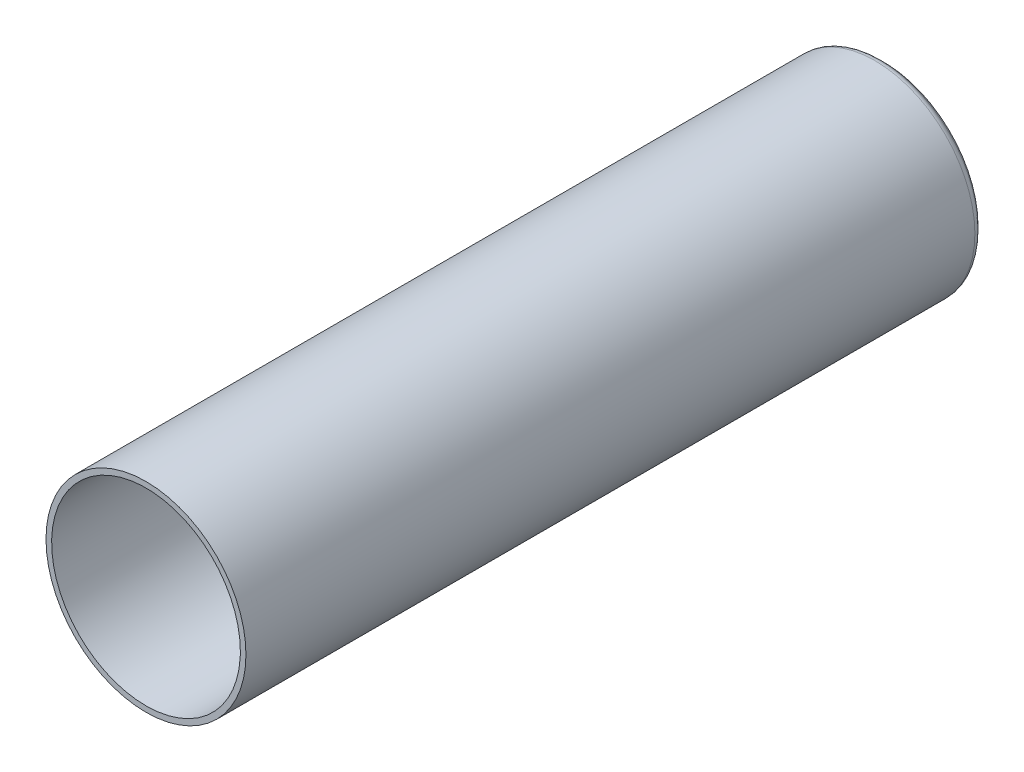
ISO-10303-21;
HEADER;
FILE_DESCRIPTION(('STEP AP214'),'2;1');
FILE_NAME('part.step','',(''),(''),'','','');
FILE_SCHEMA(('AUTOMOTIVE_DESIGN { 1 0 10303 214 1 1 1 1 }'));
ENDSEC;
DATA;
#1=APPLICATION_CONTEXT('core data for automotive mechanical design processes');
#2=APPLICATION_PROTOCOL_DEFINITION('international standard','automotive_design',2000,#1);
#3=PRODUCT_CONTEXT('',#1,'mechanical');
#4=PRODUCT('Part','Part','',(#3));
#5=PRODUCT_RELATED_PRODUCT_CATEGORY('part','',(#4));
#6=PRODUCT_DEFINITION_FORMATION('','',#4);
#7=PRODUCT_DEFINITION_CONTEXT('part definition',#1,'design');
#8=PRODUCT_DEFINITION('design','',#6,#7);
#9=PRODUCT_DEFINITION_SHAPE('','',#8);
#10=(LENGTH_UNIT() NAMED_UNIT(*) SI_UNIT(.MILLI.,.METRE.));
#11=(NAMED_UNIT(*) PLANE_ANGLE_UNIT() SI_UNIT($,.RADIAN.));
#12=(NAMED_UNIT(*) SI_UNIT($,.STERADIAN.) SOLID_ANGLE_UNIT());
#13=UNCERTAINTY_MEASURE_WITH_UNIT(LENGTH_MEASURE(1.E-05),#10,'distance_accuracy_value','');
#14=(GEOMETRIC_REPRESENTATION_CONTEXT(3) GLOBAL_UNCERTAINTY_ASSIGNED_CONTEXT((#13)) GLOBAL_UNIT_ASSIGNED_CONTEXT((#10,
#11,#12)) REPRESENTATION_CONTEXT('',''));
#15=CARTESIAN_POINT('',(0.,0.,0.));
#16=DIRECTION('',(0.,0.,1.));
#17=DIRECTION('',(1.,0.,0.));
#18=AXIS2_PLACEMENT_3D('',#15,#16,#17);
#19=CARTESIAN_POINT('',(0.,0.,97.));
#20=DIRECTION('',(0.,0.,1.));
#21=DIRECTION('',(1.,0.,0.));
#22=AXIS2_PLACEMENT_3D('',#19,#20,#21);
#23=PLANE('',#22);
#24=CARTESIAN_POINT('',(0.,0.,97.));
#25=DIRECTION('',(0.,0.,1.));
#26=DIRECTION('',(1.,0.,0.));
#27=AXIS2_PLACEMENT_3D('',#24,#25,#26);
#28=CIRCLE('',#27,13.35);
#29=CARTESIAN_POINT('',(-13.35,0.,97.));
#30=VERTEX_POINT('',#29);
#31=EDGE_CURVE('E126',#30,#30,#28,.T.);
#32=ORIENTED_EDGE('',*,*,#31,.T.);
#33=EDGE_LOOP('',(#32));
#34=FACE_BOUND('',#33,.T.);
#35=CARTESIAN_POINT('',(0.,0.,97.));
#36=DIRECTION('',(0.,0.,1.));
#37=DIRECTION('',(1.,0.,0.));
#38=AXIS2_PLACEMENT_3D('',#35,#36,#37);
#39=CIRCLE('',#38,12.6);
#40=CARTESIAN_POINT('',(12.6,0.,97.));
#41=VERTEX_POINT('',#40);
#42=EDGE_CURVE('E120',#41,#41,#39,.T.);
#43=ORIENTED_EDGE('',*,*,#42,.F.);
#44=EDGE_LOOP('',(#43));
#45=FACE_BOUND('',#44,.T.);
#46=ADVANCED_FACE('F46',(#34,#45),#23,.T.);
#47=CARTESIAN_POINT('',(0.,0.,97.));
#48=DIRECTION('',(0.,0.,-1.));
#49=DIRECTION('',(-1.,0.,0.));
#50=AXIS2_PLACEMENT_3D('',#47,#48,#49);
#51=CYLINDRICAL_SURFACE('',#50,13.35);
#52=CARTESIAN_POINT('',(0.,0.,-0.335786437626925));
#53=DIRECTION('',(0.,0.,-1.));
#54=DIRECTION('',(-1.,0.,0.));
#55=AXIS2_PLACEMENT_3D('',#52,#53,#54);
#56=CIRCLE('',#55,13.35);
#57=CARTESIAN_POINT('',(-13.35,0.,-0.335786437626925));
#58=VERTEX_POINT('',#57);
#59=EDGE_CURVE('E221',#58,#58,#56,.F.);
#60=CARTESIAN_POINT('',(-13.35,0.,-0.335786437626925));
#61=CARTESIAN_POINT('',(-13.35,0.,0.678128004431687));
#62=CARTESIAN_POINT('',(-13.35,0.,1.6920424464903));
#63=CARTESIAN_POINT('',(-13.35,0.,3.71987133060753));
#64=CARTESIAN_POINT('',(-13.35,0.,4.73378577266614));
#65=CARTESIAN_POINT('',(-13.35,0.,6.76161465678337));
#66=CARTESIAN_POINT('',(-13.35,0.,7.77552909884198));
#67=CARTESIAN_POINT('',(-13.35,0.,9.80335798295921));
#68=CARTESIAN_POINT('',(-13.35,0.,10.8172724250178));
#69=CARTESIAN_POINT('',(-13.35,0.,12.8451013091351));
#70=CARTESIAN_POINT('',(-13.35,0.,13.8590157511937));
#71=CARTESIAN_POINT('',(-13.35,0.,15.8868446353109));
#72=CARTESIAN_POINT('',(-13.35,0.,16.9007590773695));
#73=CARTESIAN_POINT('',(-13.35,0.,18.9285879614867));
#74=CARTESIAN_POINT('',(-13.35,0.,19.9425024035454));
#75=CARTESIAN_POINT('',(-13.35,0.,21.9703312876626));
#76=CARTESIAN_POINT('',(-13.35,0.,22.9842457297212));
#77=CARTESIAN_POINT('',(-13.35,0.,25.0120746138384));
#78=CARTESIAN_POINT('',(-13.35,0.,26.025989055897));
#79=CARTESIAN_POINT('',(-13.35,0.,28.0538179400143));
#80=CARTESIAN_POINT('',(-13.35,0.,29.0677323820729));
#81=CARTESIAN_POINT('',(-13.35,0.,31.0955612661901));
#82=CARTESIAN_POINT('',(-13.35,0.,32.1094757082487));
#83=CARTESIAN_POINT('',(-13.35,0.,34.137304592366));
#84=CARTESIAN_POINT('',(-13.35,0.,35.1512190344246));
#85=CARTESIAN_POINT('',(-13.35,0.,37.1790479185418));
#86=CARTESIAN_POINT('',(-13.35,0.,38.1929623606004));
#87=CARTESIAN_POINT('',(-13.35,0.,40.2207912447176));
#88=CARTESIAN_POINT('',(-13.35,0.,41.2347056867762));
#89=CARTESIAN_POINT('',(-13.35,0.,43.2625345708935));
#90=CARTESIAN_POINT('',(-13.35,0.,44.2764490129521));
#91=CARTESIAN_POINT('',(-13.35,0.,46.3042778970693));
#92=CARTESIAN_POINT('',(-13.35,0.,47.3181923391279));
#93=CARTESIAN_POINT('',(-13.35,0.,49.3460212232452));
#94=CARTESIAN_POINT('',(-13.35,0.,50.3599356653038));
#95=CARTESIAN_POINT('',(-13.35,0.,52.387764549421));
#96=CARTESIAN_POINT('',(-13.35,0.,53.4016789914796));
#97=CARTESIAN_POINT('',(-13.35,0.,55.4295078755968));
#98=CARTESIAN_POINT('',(-13.35,0.,56.4434223176555));
#99=CARTESIAN_POINT('',(-13.35,0.,58.4712512017727));
#100=CARTESIAN_POINT('',(-13.35,0.,59.4851656438313));
#101=CARTESIAN_POINT('',(-13.35,0.,61.5129945279485));
#102=CARTESIAN_POINT('',(-13.35,0.,62.5269089700071));
#103=CARTESIAN_POINT('',(-13.35,0.,64.5547378541244));
#104=CARTESIAN_POINT('',(-13.35,0.,65.568652296183));
#105=CARTESIAN_POINT('',(-13.35,0.,67.5964811803002));
#106=CARTESIAN_POINT('',(-13.35,0.,68.6103956223588));
#107=CARTESIAN_POINT('',(-13.35,0.,70.638224506476));
#108=CARTESIAN_POINT('',(-13.35,0.,71.6521389485346));
#109=CARTESIAN_POINT('',(-13.35,0.,73.6799678326519));
#110=CARTESIAN_POINT('',(-13.35,0.,74.6938822747105));
#111=CARTESIAN_POINT('',(-13.35,0.,76.7217111588277));
#112=CARTESIAN_POINT('',(-13.35,0.,77.7356256008863));
#113=CARTESIAN_POINT('',(-13.35,0.,79.7634544850036));
#114=CARTESIAN_POINT('',(-13.35,0.,80.7773689270622));
#115=CARTESIAN_POINT('',(-13.35,0.,82.8051978111794));
#116=CARTESIAN_POINT('',(-13.35,0.,83.819112253238));
#117=CARTESIAN_POINT('',(-13.35,0.,85.8469411373552));
#118=CARTESIAN_POINT('',(-13.35,0.,86.8608555794139));
#119=CARTESIAN_POINT('',(-13.35,0.,88.8886844635311));
#120=CARTESIAN_POINT('',(-13.35,0.,89.9025989055897));
#121=CARTESIAN_POINT('',(-13.35,0.,91.9304277897069));
#122=CARTESIAN_POINT('',(-13.35,0.,92.9443422317655));
#123=CARTESIAN_POINT('',(-13.35,0.,94.9721711158828));
#124=CARTESIAN_POINT('',(-13.35,0.,95.9860855579414));
#125=CARTESIAN_POINT('',(-13.35,0.,97.));
#126=B_SPLINE_CURVE_WITH_KNOTS('',3,(#60,#61,#62,#63,#64,#65,#66,#67,#68,#69,#70,#71,#72,#73,
#74,#75,#76,#77,#78,#79,#80,#81,#82,#83,#84,#85,#86,#87,#88,#89,#90,#91,#92,#93,#94,#95,#96,#97,
#98,#99,#100,#101,#102,#103,#104,#105,#106,#107,#108,#109,#110,#111,#112,#113,#114,#115,#116,
#117,#118,#119,#120,#121,#122,#123,#124,#125),.UNSPECIFIED.,.F.,.F.,(4,2,2,2,2,2,2,2,2,2,2,2,2,
2,2,2,2,2,2,2,2,2,2,2,2,2,2,2,2,2,2,2,4),(0.,3.04174332617584,6.08348665235169,9.12522997852752,
12.1669733047034,15.2087166308792,18.250459957055,21.2922032832309,24.3339466094067,
27.3756899355826,30.4174332617584,33.4591765879343,36.5009199141101,39.5426632402859,
42.5844065664618,45.6261498926376,48.6678932188135,51.7096365449893,54.7513798711651,
57.793123197341,60.8348665235168,63.8766098496927,66.9183531758685,69.9600965020444,
73.0018398282202,76.043583154396,79.0853264805719,82.1270698067477,85.1688131329236,
88.2105564590994,91.2522997852752,94.2940431114511,97.3357864376269),.UNSPECIFIED.);
#127=EDGE_CURVE('BSEAM167',#58,#30,#126,.T.);
#128=ORIENTED_EDGE('',*,*,#59,.T.);
#129=ORIENTED_EDGE('',*,*,#31,.F.);
#130=ORIENTED_EDGE('',*,*,#127,.T.);
#131=ORIENTED_EDGE('',*,*,#127,.F.);
#132=EDGE_LOOP('',(#128,#130,#129,#131));
#133=FACE_BOUND('',#132,.T.);
#134=ADVANCED_FACE('F167',(#133),#51,.T.);
#135=CARTESIAN_POINT('',(0.,0.,97.));
#136=DIRECTION('',(0.,0.,-1.));
#137=DIRECTION('',(-1.,0.,0.));
#138=AXIS2_PLACEMENT_3D('',#135,#136,#137);
#139=CYLINDRICAL_SURFACE('',#138,12.6);
#140=DIRECTION('',(0.,0.,-1.));
#141=VECTOR('',#140,1.);
#142=CARTESIAN_POINT('',(12.5776587646509,0.75,97.));
#143=LINE('',#142,#141);
#144=CARTESIAN_POINT('',(12.5776587646509,0.75,8.54961277568034));
#145=VERTEX_POINT('',#144);
#146=CARTESIAN_POINT('',(12.5776587646509,0.75,0.));
#147=VERTEX_POINT('',#146);
#148=EDGE_CURVE('E112',#145,#147,#143,.T.);
#149=ORIENTED_EDGE('',*,*,#148,.F.);
#150=CARTESIAN_POINT('',(12.5776587646509,0.75,8.54961277568031));
#151=CARTESIAN_POINT('',(12.5776587958293,0.74999846262089,8.71626885359949));
#152=CARTESIAN_POINT('',(12.5776839016945,0.749578647417388,8.8829245764544));
#153=CARTESIAN_POINT('',(12.5777839187885,0.747898809080807,9.21625909120077));
#154=CARTESIAN_POINT('',(12.5778588381816,0.746638648219097,9.38293788239521));
#155=CARTESIAN_POINT('',(12.5781578596453,0.741591163751137,9.88308234283975));
#156=CARTESIAN_POINT('',(12.5784562244901,0.736536833996591,10.2165363071549));
#157=CARTESIAN_POINT('',(12.579252163952,0.72281529775297,10.8833800816436));
#158=CARTESIAN_POINT('',(12.5797497448372,0.714147977585219,11.2167698894683));
#159=CARTESIAN_POINT('',(12.5809508889492,0.692672414551467,11.8833770291066));
#160=CARTESIAN_POINT('',(12.5816544246518,0.679864724987406,12.2165943780109));
#161=CARTESIAN_POINT('',(12.5828780305514,0.656687126151226,12.7162275295513));
#162=CARTESIAN_POINT('',(12.5833139377602,0.648300484714436,12.8827359872881));
#163=CARTESIAN_POINT('',(12.5842463504584,0.62994407034691,13.2156647861657));
#164=CARTESIAN_POINT('',(12.5847428551534,0.619974318167248,13.3820851284328));
#165=CARTESIAN_POINT('',(12.5857059030217,0.600072226494588,13.6841933772001));
#166=CARTESIAN_POINT('',(12.586161155723,0.590470389909984,13.8199029772125));
#167=CARTESIAN_POINT('',(12.5871229161089,0.569602469362661,14.0911945269026));
#168=CARTESIAN_POINT('',(12.5876294230938,0.558336408117535,14.2267764782973));
#169=CARTESIAN_POINT('',(12.5885202818252,0.537795061097529,14.4513069780916));
#170=CARTESIAN_POINT('',(12.588887010228,0.529160662343217,14.5403135832583));
#171=CARTESIAN_POINT('',(12.5896528280691,0.510614129104042,14.7181913711355));
#172=CARTESIAN_POINT('',(12.5900519169201,0.500702017807128,14.8070625562741));
#173=CARTESIAN_POINT('',(12.5910215482825,0.475799113965,15.0123640573098));
#174=CARTESIAN_POINT('',(12.5916066847787,0.46018938165714,15.1287235543876));
#175=CARTESIAN_POINT('',(12.5926701197426,0.429889325023043,15.3207106424713));
#176=CARTESIAN_POINT('',(12.5931158608058,0.416732141342184,15.3965715843711));
#177=CARTESIAN_POINT('',(12.5939259350518,0.391321971679258,15.5214790463265));
#178=CARTESIAN_POINT('',(12.5942654671117,0.380317015828065,15.5707660864049));
#179=CARTESIAN_POINT('',(12.5948851774383,0.359080482936559,15.65164883264));
#180=CARTESIAN_POINT('',(12.5951456978106,0.349881116370465,15.6835075320191));
#181=CARTESIAN_POINT('',(12.5956244930668,0.332107562477385,15.7355726409061));
#182=CARTESIAN_POINT('',(12.5958268845493,0.324389714687729,15.7560482513722));
#183=CARTESIAN_POINT('',(12.5961614254018,0.311022837639958,15.7854726887928));
#184=CARTESIAN_POINT('',(12.5962753525415,0.306385840912978,15.7948773424706));
#185=CARTESIAN_POINT('',(12.5965200163779,0.296160000393068,15.8131581666696));
#186=CARTESIAN_POINT('',(12.5966506874401,0.290574846889792,15.8220362125458));
#187=CARTESIAN_POINT('',(12.5968505097858,0.281714041159456,15.8333464408042));
#188=CARTESIAN_POINT('',(12.5969071676113,0.279172059415722,15.8363438698947));
#189=CARTESIAN_POINT('',(12.5970258939271,0.273762738667799,15.8420420312897));
#190=CARTESIAN_POINT('',(12.5970879634886,0.270895335217363,15.8447427046158));
#191=CARTESIAN_POINT('',(12.5972005208725,0.265601160440524,15.8489755370526));
#192=CARTESIAN_POINT('',(12.5972495122913,0.263269426324223,15.8506249759758));
#193=CARTESIAN_POINT('',(12.5973507838717,0.258377884877524,15.8535315773579));
#194=CARTESIAN_POINT('',(12.597403045483,0.255819334826131,15.8547907473103));
#195=CARTESIAN_POINT('',(12.5974773369364,0.252122673281987,15.8561618944995));
#196=CARTESIAN_POINT('',(12.5974983979537,0.251068286867012,15.8565055430289));
#197=CARTESIAN_POINT('',(12.597519597127,0.249999999999973,15.8568023840333));
#198=B_SPLINE_CURVE_WITH_KNOTS('',3,(#150,#151,#152,#153,#154,#155,#156,#157,#158,#159,#160,
#161,#162,#163,#164,#165,#166,#167,#168,#169,#170,#171,#172,#173,#174,#175,#176,#177,#178,#179,
#180,#181,#182,#183,#184,#185,#186,#187,#188,#189,#190,#191,#192,#193,#194,#195,#196,#197),
.UNSPECIFIED.,.F.,.F.,(4,2,2,2,2,2,2,2,2,2,2,2,2,2,2,2,2,2,2,2,2,2,2,4),(0.,0.49996699431315,
1.00001595096966,2.00047322349686,3.00096197666259,4.00131708385734,4.50147191138012,
5.00162018352287,5.40976170916635,5.81789766396599,6.08616525070789,6.35442796961015,
6.70656322585354,6.93748424340277,7.08890877950643,7.18833312145062,7.25385703474364,
7.28529848345986,7.31662025360448,7.32839673819558,7.34017555907506,7.34872180902802,
7.35722333919696,7.36054816669538),.UNSPECIFIED.);
#199=CARTESIAN_POINT('',(12.5975195971271,0.249999999999993,15.8568023840333));
#200=VERTEX_POINT('',#199);
#201=EDGE_CURVE('E149',#145,#200,#198,.T.);
#202=ORIENTED_EDGE('',*,*,#201,.T.);
#203=CARTESIAN_POINT('',(0.,0.,-160.783054688061));
#204=DIRECTION('',(-0.997466564503137,0.,0.0711368589291754));
#205=DIRECTION('',(-0.0711368589291754,0.,-0.997466564503137));
#206=AXIS2_PLACEMENT_3D('',#203,#204,#205);
#207=ELLIPSE('',#206,177.123367402892,12.6);
#208=CARTESIAN_POINT('',(12.5975195971271,-0.249999999999996,15.8568023840333));
#209=VERTEX_POINT('',#208);
#210=EDGE_CURVE('E121',#209,#200,#207,.T.);
#211=ORIENTED_EDGE('',*,*,#210,.F.);
#212=CARTESIAN_POINT('',(12.5975195971271,-0.25,15.8568023840333));
#213=CARTESIAN_POINT('',(12.5974623047581,-0.252886751006367,15.8559974818459));
#214=CARTESIAN_POINT('',(12.5974065146621,-0.255648330979727,15.8548661562991));
#215=CARTESIAN_POINT('',(12.5972993147629,-0.260876761445982,15.8521447338545));
#216=CARTESIAN_POINT('',(12.5972478436345,-0.263348068209666,15.8505633792118));
#217=CARTESIAN_POINT('',(12.597116896998,-0.26955689803349,15.8459888287967));
#218=CARTESIAN_POINT('',(12.5970404802817,-0.273097610335365,15.8427381506363));
#219=CARTESIAN_POINT('',(12.5968948787091,-0.279732494257571,15.8357578835234));
#220=CARTESIAN_POINT('',(12.5968257889182,-0.282820957136403,15.8320231366595));
#221=CARTESIAN_POINT('',(12.5965411897505,-0.295374005918529,15.8154393058387));
#222=CARTESIAN_POINT('',(12.5963542138653,-0.303174225172223,15.801375283792));
#223=CARTESIAN_POINT('',(12.5960091974761,-0.317168999195673,15.7725455452846));
#224=CARTESIAN_POINT('',(12.5958512565248,-0.323358058847809,15.7577776255059));
#225=CARTESIAN_POINT('',(12.5953494100055,-0.342584090364532,15.7076137202974));
#226=CARTESIAN_POINT('',(12.5950438279847,-0.353523510507369,15.6714067830386));
#227=CARTESIAN_POINT('',(12.5944727822485,-0.373286565530063,15.5984109681307));
#228=CARTESIAN_POINT('',(12.5942074300807,-0.382104355943692,15.5616207739564));
#229=CARTESIAN_POINT('',(12.5937029150032,-0.398390648221106,15.4876968394028));
#230=CARTESIAN_POINT('',(12.5934637746816,-0.405857989880949,15.4505628321622));
#231=CARTESIAN_POINT('',(12.5930040618688,-0.419876787132959,15.3761816586973));
#232=CARTESIAN_POINT('',(12.5927834650603,-0.426429449899148,15.3389347091944));
#233=CARTESIAN_POINT('',(12.5921455803583,-0.444999884956575,15.2276044784451));
#234=CARTESIAN_POINT('',(12.59174847213,-0.456046617233203,15.1533587196567));
#235=CARTESIAN_POINT('',(12.590990525202,-0.476507183493287,15.0046402308038));
#236=CARTESIAN_POINT('',(12.5906296920104,-0.485920769650633,14.9301674680339));
#237=CARTESIAN_POINT('',(12.5895878440804,-0.51244269501176,14.7064138055281));
#238=CARTESIAN_POINT('',(12.5889481844055,-0.527812698436482,14.5569274474946));
#239=CARTESIAN_POINT('',(12.5877466568212,-0.555717133773181,14.2579527646896));
#240=CARTESIAN_POINT('',(12.5871846620919,-0.568256210075438,14.1084648514821));
#241=CARTESIAN_POINT('',(12.5861234010537,-0.591295926664365,13.8093965751212));
#242=CARTESIAN_POINT('',(12.5856241081817,-0.601797431184252,13.6598162782779));
#243=CARTESIAN_POINT('',(12.5844999975285,-0.624932556887581,13.3036810894044));
#244=CARTESIAN_POINT('',(12.5838996026766,-0.636859400743842,13.0970807184458));
#245=CARTESIAN_POINT('',(12.5827895904366,-0.658422443923393,12.6837585543861));
#246=CARTESIAN_POINT('',(12.5822799750698,-0.668058592238381,12.477036758684));
#247=CARTESIAN_POINT('',(12.5808764249833,-0.694161825620634,11.8566333012263));
#248=CARTESIAN_POINT('',(12.5801081489056,-0.707816593382423,11.4428315152279));
#249=CARTESIAN_POINT('',(12.5791887419052,-0.72390223804508,10.8223453398937));
#250=CARTESIAN_POINT('',(12.5789212241726,-0.728529489821273,10.6157119848103));
#251=CARTESIAN_POINT('',(12.5784627070811,-0.736405231329604,10.2024173840893));
#252=CARTESIAN_POINT('',(12.578271707974,-0.739653716524277,9.995756138362));
#253=CARTESIAN_POINT('',(12.5779658073444,-0.744837466650514,9.58251783541201));
#254=CARTESIAN_POINT('',(12.577850868918,-0.746773368446736,9.37594078603345));
#255=CARTESIAN_POINT('',(12.5776973986788,-0.749352082651612,8.96278009819081));
#256=CARTESIAN_POINT('',(12.5776588663007,-0.749994904626856,8.75619645978678));
#257=CARTESIAN_POINT('',(12.577658764651,-0.750000000000013,8.54961277568032));
#258=B_SPLINE_CURVE_WITH_KNOTS('',3,(#212,#213,#214,#215,#216,#217,#218,#219,#220,#221,#222,
#223,#224,#225,#226,#227,#228,#229,#230,#231,#232,#233,#234,#235,#236,#237,#238,#239,#240,#241,
#242,#243,#244,#245,#246,#247,#248,#249,#250,#251,#252,#253,#254,#255,#256,#257),.UNSPECIFIED.,
.F.,.F.,(4,2,2,2,2,2,2,2,2,2,2,2,2,2,2,2,2,2,2,2,2,2,4),(0.,0.00892458622921327,
0.0176864259079112,0.0320323998488301,0.0465462088782962,0.094425982527855,0.142466979405753,
0.255667392919063,0.36917615888183,0.482781984507435,0.596236428529164,0.821391895870496,
1.04658150019967,1.49735463144107,1.94738276618382,2.39721960284345,3.01803783729245,
3.63886989458153,4.88088843369203,5.50094198542542,6.12099757771427,6.74075210370573,
7.36050204455123),.UNSPECIFIED.);
#259=CARTESIAN_POINT('',(12.5776587646509,-0.75,8.54961277568035));
#260=VERTEX_POINT('',#259);
#261=EDGE_CURVE('E70',#209,#260,#258,.T.);
#262=ORIENTED_EDGE('',*,*,#261,.T.);
#263=DIRECTION('',(0.,0.,-1.));
#264=VECTOR('',#263,1.);
#265=CARTESIAN_POINT('',(12.5776587646509,-0.75,97.));
#266=LINE('',#265,#264);
#267=CARTESIAN_POINT('',(12.5776587646509,-0.75,0.));
#268=VERTEX_POINT('',#267);
#269=EDGE_CURVE('E98',#260,#268,#266,.T.);
#270=ORIENTED_EDGE('',*,*,#269,.T.);
#271=CARTESIAN_POINT('',(0.,0.,0.));
#272=DIRECTION('',(0.,0.,1.));
#273=DIRECTION('',(1.,0.,0.));
#274=AXIS2_PLACEMENT_3D('',#271,#272,#273);
#275=CIRCLE('',#274,12.6);
#276=EDGE_CURVE('E110',#147,#268,#275,.T.);
#277=ORIENTED_EDGE('',*,*,#276,.F.);
#278=EDGE_LOOP('',(#149,#202,#211,#262,#270,#277));
#279=FACE_BOUND('',#278,.T.);
#280=ORIENTED_EDGE('',*,*,#42,.T.);
#281=EDGE_LOOP('',(#280));
#282=FACE_BOUND('',#281,.T.);
#283=ADVANCED_FACE('F108',(#279,#282),#139,.F.);
#284=CARTESIAN_POINT('',(0.,0.,0.));
#285=DIRECTION('',(0.,0.,-1.));
#286=DIRECTION('',(-1.,0.,0.));
#287=AXIS2_PLACEMENT_3D('',#284,#285,#286);
#288=PLANE('',#287);
#289=CARTESIAN_POINT('',(0.,0.,0.));
#290=DIRECTION('',(0.,0.,1.));
#291=DIRECTION('',(1.,0.,0.));
#292=AXIS2_PLACEMENT_3D('',#289,#290,#291);
#293=CIRCLE('',#292,4.5);
#294=CARTESIAN_POINT('',(4.5,0.,0.));
#295=VERTEX_POINT('',#294);
#296=EDGE_CURVE('E104',#295,#295,#293,.T.);
#297=ORIENTED_EDGE('',*,*,#296,.F.);
#298=EDGE_LOOP('',(#297));
#299=FACE_BOUND('',#298,.T.);
#300=DIRECTION('',(0.,-1.,0.));
#301=VECTOR('',#300,1.);
#302=CARTESIAN_POINT('',(11.4666515014905,0.75,0.));
#303=LINE('',#302,#301);
#304=CARTESIAN_POINT('',(11.4666515014905,0.25,0.));
#305=VERTEX_POINT('',#304);
#306=CARTESIAN_POINT('',(11.4666515014905,-0.25,0.));
#307=VERTEX_POINT('',#306);
#308=EDGE_CURVE('E113',#305,#307,#303,.T.);
#309=ORIENTED_EDGE('',*,*,#308,.F.);
#310=CARTESIAN_POINT('',(11.9679214365375,0.25,0.));
#311=DIRECTION('',(0.,0.,-1.));
#312=DIRECTION('',(-1.,0.,0.));
#313=AXIS2_PLACEMENT_3D('',#310,#311,#312);
#314=ELLIPSE('',#313,0.501269935046958,0.5);
#315=CARTESIAN_POINT('',(11.9679214365375,0.75,0.));
#316=VERTEX_POINT('',#315);
#317=EDGE_CURVE('E146',#305,#316,#314,.T.);
#318=ORIENTED_EDGE('',*,*,#317,.T.);
#319=DIRECTION('',(1.,0.,0.));
#320=VECTOR('',#319,1.);
#321=CARTESIAN_POINT('',(0.,0.75,0.));
#322=LINE('',#321,#320);
#323=EDGE_CURVE('E103',#316,#147,#322,.T.);
#324=ORIENTED_EDGE('',*,*,#323,.T.);
#325=ORIENTED_EDGE('',*,*,#276,.T.);
#326=DIRECTION('',(1.,0.,0.));
#327=VECTOR('',#326,1.);
#328=CARTESIAN_POINT('',(0.,-0.75,0.));
#329=LINE('',#328,#327);
#330=CARTESIAN_POINT('',(11.9679214365375,-0.75,0.));
#331=VERTEX_POINT('',#330);
#332=EDGE_CURVE('E96',#331,#268,#329,.T.);
#333=ORIENTED_EDGE('',*,*,#332,.F.);
#334=CARTESIAN_POINT('',(11.9679214365375,-0.25,0.));
#335=DIRECTION('',(0.,0.,-1.));
#336=DIRECTION('',(1.,0.,0.));
#337=AXIS2_PLACEMENT_3D('',#334,#335,#336);
#338=ELLIPSE('',#337,0.501269935046958,0.5);
#339=EDGE_CURVE('E62',#331,#307,#338,.T.);
#340=ORIENTED_EDGE('',*,*,#339,.T.);
#341=EDGE_LOOP('',(#309,#318,#324,#325,#333,#340));
#342=FACE_BOUND('',#341,.T.);
#343=ADVANCED_FACE('F116',(#299,#342),#288,.F.);
#344=CARTESIAN_POINT('',(0.,0.,-1.5));
#345=DIRECTION('',(0.,0.,-1.));
#346=DIRECTION('',(-1.,0.,0.));
#347=AXIS2_PLACEMENT_3D('',#344,#345,#346);
#348=PLANE('',#347);
#349=CARTESIAN_POINT('',(0.,0.,-1.5));
#350=DIRECTION('',(0.,0.,-1.));
#351=DIRECTION('',(-1.,0.,0.));
#352=AXIS2_PLACEMENT_3D('',#349,#350,#351);
#353=CIRCLE('',#352,12.6);
#354=CARTESIAN_POINT('',(-12.6,0.,-1.5));
#355=VERTEX_POINT('',#354);
#356=EDGE_CURVE('E224',#355,#355,#353,.T.);
#357=ORIENTED_EDGE('',*,*,#356,.T.);
#358=EDGE_LOOP('',(#357));
#359=FACE_BOUND('',#358,.T.);
#360=CARTESIAN_POINT('',(0.,0.,-1.5));
#361=DIRECTION('',(0.,0.,-1.));
#362=DIRECTION('',(-1.,0.,0.));
#363=AXIS2_PLACEMENT_3D('',#360,#361,#362);
#364=CIRCLE('',#363,5.25);
#365=CARTESIAN_POINT('',(-5.25,0.,-1.5));
#366=VERTEX_POINT('',#365);
#367=EDGE_CURVE('E176',#366,#366,#364,.F.);
#368=ORIENTED_EDGE('',*,*,#367,.T.);
#369=EDGE_LOOP('',(#368));
#370=FACE_BOUND('',#369,.T.);
#371=ADVANCED_FACE('F264',(#359,#370),#348,.T.);
#372=CARTESIAN_POINT('',(11.4086250539592,0.75,-0.813635042938625));
#373=DIRECTION('',(-0.997466564503137,0.,0.0711368589291754));
#374=DIRECTION('',(0.0711368589291754,0.,0.997466564503137));
#375=AXIS2_PLACEMENT_3D('',#372,#373,#374);
#376=PLANE('',#375);
#377=ORIENTED_EDGE('',*,*,#210,.T.);
#378=DIRECTION('',(-0.0711368589291754,0.,-0.997466564503137));
#379=VECTOR('',#378,1.);
#380=CARTESIAN_POINT('',(11.4086250539592,0.25,-0.813635042938625));
#381=LINE('',#380,#379);
#382=EDGE_CURVE('E137',#200,#305,#381,.T.);
#383=ORIENTED_EDGE('',*,*,#382,.T.);
#384=ORIENTED_EDGE('',*,*,#308,.T.);
#385=DIRECTION('',(-0.0711368589291754,0.,-0.997466564503137));
#386=VECTOR('',#385,1.);
#387=CARTESIAN_POINT('',(12.5776587646512,-0.25,15.5783178313551));
#388=LINE('',#387,#386);
#389=EDGE_CURVE('E134',#307,#209,#388,.F.);
#390=ORIENTED_EDGE('',*,*,#389,.T.);
#391=EDGE_LOOP('',(#377,#383,#384,#390));
#392=FACE_BOUND('',#391,.T.);
#393=ADVANCED_FACE('F258',(#392),#376,.T.);
#394=CARTESIAN_POINT('',(0.,0.75,0.));
#395=DIRECTION('',(0.,1.,0.));
#396=DIRECTION('',(0.,0.,1.));
#397=AXIS2_PLACEMENT_3D('',#394,#395,#396);
#398=PLANE('',#397);
#399=ORIENTED_EDGE('',*,*,#323,.F.);
#400=DIRECTION('',(-0.0711368589291754,0.,-0.997466564503137));
#401=VECTOR('',#400,1.);
#402=CARTESIAN_POINT('',(11.9073583362108,0.75,-0.849203472403213));
#403=LINE('',#402,#401);
#404=EDGE_CURVE('E141',#316,#145,#403,.F.);
#405=ORIENTED_EDGE('',*,*,#404,.T.);
#406=ORIENTED_EDGE('',*,*,#148,.T.);
#407=EDGE_LOOP('',(#399,#405,#406));
#408=FACE_BOUND('',#407,.T.);
#409=ADVANCED_FACE('F252',(#408),#398,.T.);
#410=CARTESIAN_POINT('',(0.,-0.75,0.));
#411=DIRECTION('',(0.,1.,0.));
#412=DIRECTION('',(0.,0.,1.));
#413=AXIS2_PLACEMENT_3D('',#410,#411,#412);
#414=PLANE('',#413);
#415=ORIENTED_EDGE('',*,*,#269,.F.);
#416=DIRECTION('',(-0.0711368589291754,0.,-0.997466564503137));
#417=VECTOR('',#416,1.);
#418=CARTESIAN_POINT('',(11.9653847837421,-0.75,-0.0355684294645877));
#419=LINE('',#418,#417);
#420=EDGE_CURVE('E99',#260,#331,#419,.T.);
#421=ORIENTED_EDGE('',*,*,#420,.T.);
#422=ORIENTED_EDGE('',*,*,#332,.T.);
#423=EDGE_LOOP('',(#415,#421,#422));
#424=FACE_BOUND('',#423,.T.);
#425=ADVANCED_FACE('F97',(#424),#414,.F.);
#426=CARTESIAN_POINT('',(11.9073583362108,0.25,-0.849203472403213));
#427=DIRECTION('',(-0.0711368589291754,0.,-0.997466564503137));
#428=DIRECTION('',(-0.997466564503137,0.,0.0711368589291754));
#429=AXIS2_PLACEMENT_3D('',#426,#427,#428);
#430=CYLINDRICAL_SURFACE('',#429,0.5);
#431=ORIENTED_EDGE('',*,*,#201,.F.);
#432=ORIENTED_EDGE('',*,*,#404,.F.);
#433=ORIENTED_EDGE('',*,*,#317,.F.);
#434=ORIENTED_EDGE('',*,*,#382,.F.);
#435=EDGE_LOOP('',(#431,#432,#433,#434));
#436=FACE_BOUND('',#435,.T.);
#437=ADVANCED_FACE('F159',(#436),#430,.T.);
#438=CARTESIAN_POINT('',(11.9073583362108,-0.25,-0.849203472403213));
#439=DIRECTION('',(0.0711368589291754,0.,0.997466564503137));
#440=DIRECTION('',(0.997466564503137,0.,-0.0711368589291754));
#441=AXIS2_PLACEMENT_3D('',#438,#439,#440);
#442=CYLINDRICAL_SURFACE('',#441,0.5);
#443=ORIENTED_EDGE('',*,*,#261,.F.);
#444=ORIENTED_EDGE('',*,*,#389,.F.);
#445=ORIENTED_EDGE('',*,*,#339,.F.);
#446=ORIENTED_EDGE('',*,*,#420,.F.);
#447=EDGE_LOOP('',(#443,#444,#445,#446));
#448=FACE_BOUND('',#447,.T.);
#449=ADVANCED_FACE('F178',(#448),#442,.T.);
#450=CARTESIAN_POINT('',(0.,0.,-1.5));
#451=DIRECTION('',(0.,0.,1.));
#452=DIRECTION('',(1.,0.,0.));
#453=AXIS2_PLACEMENT_3D('',#450,#451,#452);
#454=CYLINDRICAL_SURFACE('',#453,4.5);
#455=CARTESIAN_POINT('',(0.,0.,-0.335786437626901));
#456=DIRECTION('',(0.,0.,1.));
#457=DIRECTION('',(1.,0.,0.));
#458=AXIS2_PLACEMENT_3D('',#455,#456,#457);
#459=CIRCLE('',#458,4.5);
#460=CARTESIAN_POINT('',(4.5,0.,-0.335786437626901));
#461=VERTEX_POINT('',#460);
#462=EDGE_CURVE('E55',#461,#461,#459,.F.);
#463=ORIENTED_EDGE('',*,*,#462,.T.);
#464=EDGE_LOOP('',(#463));
#465=FACE_BOUND('',#464,.T.);
#466=ORIENTED_EDGE('',*,*,#296,.T.);
#467=EDGE_LOOP('',(#466));
#468=FACE_BOUND('',#467,.T.);
#469=ADVANCED_FACE('F182',(#465,#468),#454,.F.);
#470=CARTESIAN_POINT('',(0.,0.,-1.5));
#471=DIRECTION('',(0.,0.,1.));
#472=DIRECTION('',(1.,0.,0.));
#473=AXIS2_PLACEMENT_3D('',#470,#471,#472);
#474=CONICAL_SURFACE('',#473,12.6,0.78539816339745);
#475=CARTESIAN_POINT('',(0.,0.,-1.04289321881348));
#476=DIRECTION('',(0.,0.,1.));
#477=DIRECTION('',(1.,0.,0.));
#478=AXIS2_PLACEMENT_3D('',#475,#476,#477);
#479=CIRCLE('',#478,13.0571067811866);
#480=CARTESIAN_POINT('',(13.0571067811866,0.,-1.04289321881348));
#481=VERTEX_POINT('',#480);
#482=EDGE_CURVE('E223',#481,#481,#479,.F.);
#483=ORIENTED_EDGE('',*,*,#482,.T.);
#484=EDGE_LOOP('',(#483));
#485=FACE_BOUND('',#484,.T.);
#486=ORIENTED_EDGE('',*,*,#356,.F.);
#487=EDGE_LOOP('',(#486));
#488=FACE_BOUND('',#487,.T.);
#489=ADVANCED_FACE('F184',(#485,#488),#474,.T.);
#490=CARTESIAN_POINT('',(0.,0.,-1.5));
#491=DIRECTION('',(0.,0.,-1.));
#492=DIRECTION('',(-1.,0.,0.));
#493=AXIS2_PLACEMENT_3D('',#490,#491,#492);
#494=CONICAL_SURFACE('',#493,5.25,0.78539816339745);
#495=CARTESIAN_POINT('',(0.,0.,-1.04289321881345));
#496=DIRECTION('',(0.,0.,-1.));
#497=DIRECTION('',(-1.,0.,0.));
#498=AXIS2_PLACEMENT_3D('',#495,#496,#497);
#499=CIRCLE('',#498,4.79289321881345);
#500=CARTESIAN_POINT('',(-4.79289321881345,0.,-1.04289321881345));
#501=VERTEX_POINT('',#500);
#502=EDGE_CURVE('E11',#501,#501,#499,.F.);
#503=ORIENTED_EDGE('',*,*,#502,.T.);
#504=EDGE_LOOP('',(#503));
#505=FACE_BOUND('',#504,.T.);
#506=ORIENTED_EDGE('',*,*,#367,.F.);
#507=EDGE_LOOP('',(#506));
#508=FACE_BOUND('',#507,.T.);
#509=ADVANCED_FACE('F190',(#505,#508),#494,.F.);
#510=CARTESIAN_POINT('',(0.,0.,-0.335786437626925));
#511=DIRECTION('',(0.,0.,-1.));
#512=DIRECTION('',(-1.,0.,0.));
#513=AXIS2_PLACEMENT_3D('',#510,#511,#512);
#514=TOROIDAL_SURFACE('',#513,12.35,1.);
#515=ORIENTED_EDGE('',*,*,#482,.F.);
#516=EDGE_LOOP('',(#515));
#517=FACE_BOUND('',#516,.T.);
#518=ORIENTED_EDGE('',*,*,#59,.F.);
#519=EDGE_LOOP('',(#518));
#520=FACE_BOUND('',#519,.T.);
#521=ADVANCED_FACE('F195',(#517,#520),#514,.T.);
#522=CARTESIAN_POINT('',(0.,0.,-0.335786437626901));
#523=DIRECTION('',(0.,0.,1.));
#524=DIRECTION('',(1.,0.,0.));
#525=AXIS2_PLACEMENT_3D('',#522,#523,#524);
#526=TOROIDAL_SURFACE('',#525,5.5,1.);
#527=ORIENTED_EDGE('',*,*,#502,.F.);
#528=EDGE_LOOP('',(#527));
#529=FACE_BOUND('',#528,.T.);
#530=ORIENTED_EDGE('',*,*,#462,.F.);
#531=EDGE_LOOP('',(#530));
#532=FACE_BOUND('',#531,.T.);
#533=ADVANCED_FACE('F48',(#529,#532),#526,.T.);
#534=CLOSED_SHELL('',(#46,#134,#283,#343,#371,#393,#409,#425,#437,#449,#469,#489,#509,#521,#533));
#535=MANIFOLD_SOLID_BREP('B2',#534);
#536=ADVANCED_BREP_SHAPE_REPRESENTATION('',(#18,#535),#14);
#537=SHAPE_DEFINITION_REPRESENTATION(#9,#536);
ENDSEC;
END-ISO-10303-21;
